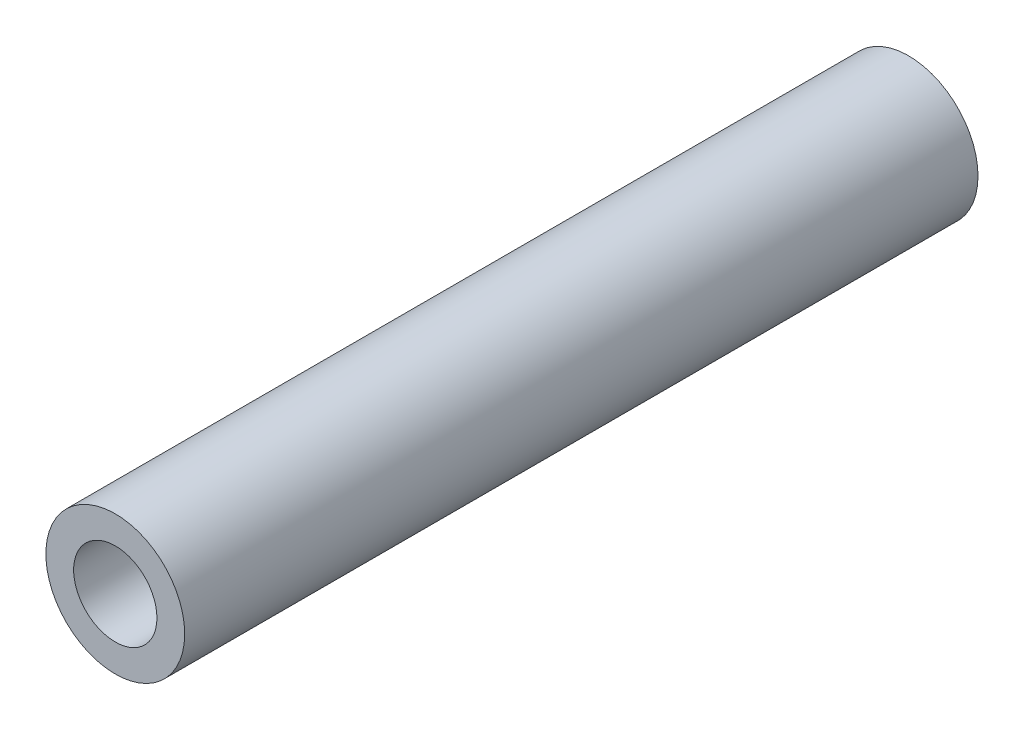
ISO-10303-21;
HEADER;
FILE_DESCRIPTION(('STEP AP214'),'2;1');
FILE_NAME('part.step','',(''),(''),'','','');
FILE_SCHEMA(('AUTOMOTIVE_DESIGN { 1 0 10303 214 1 1 1 1 }'));
ENDSEC;
DATA;
#1=APPLICATION_CONTEXT('core data for automotive mechanical design processes');
#2=APPLICATION_PROTOCOL_DEFINITION('international standard','automotive_design',2000,#1);
#3=PRODUCT_CONTEXT('',#1,'mechanical');
#4=PRODUCT('Part','Part','',(#3));
#5=PRODUCT_RELATED_PRODUCT_CATEGORY('part','',(#4));
#6=PRODUCT_DEFINITION_FORMATION('','',#4);
#7=PRODUCT_DEFINITION_CONTEXT('part definition',#1,'design');
#8=PRODUCT_DEFINITION('design','',#6,#7);
#9=PRODUCT_DEFINITION_SHAPE('','',#8);
#10=(LENGTH_UNIT() NAMED_UNIT(*) SI_UNIT(.MILLI.,.METRE.));
#11=(NAMED_UNIT(*) PLANE_ANGLE_UNIT() SI_UNIT($,.RADIAN.));
#12=(NAMED_UNIT(*) SI_UNIT($,.STERADIAN.) SOLID_ANGLE_UNIT());
#13=UNCERTAINTY_MEASURE_WITH_UNIT(LENGTH_MEASURE(1.E-05),#10,'distance_accuracy_value','');
#14=(GEOMETRIC_REPRESENTATION_CONTEXT(3) GLOBAL_UNCERTAINTY_ASSIGNED_CONTEXT((#13)) GLOBAL_UNIT_ASSIGNED_CONTEXT((#10,
#11,#12)) REPRESENTATION_CONTEXT('',''));
#15=CARTESIAN_POINT('',(0.,0.,0.));
#16=DIRECTION('',(0.,0.,1.));
#17=DIRECTION('',(1.,0.,0.));
#18=AXIS2_PLACEMENT_3D('',#15,#16,#17);
#19=CARTESIAN_POINT('',(-93.8485626491029,33.5124234951683,40.));
#20=DIRECTION('',(0.,0.,1.));
#21=DIRECTION('',(1.,0.,0.));
#22=AXIS2_PLACEMENT_3D('',#19,#20,#21);
#23=PLANE('',#22);
#24=CARTESIAN_POINT('',(-93.8485626491029,33.5124234951683,40.));
#25=DIRECTION('',(0.,0.,1.));
#26=DIRECTION('',(1.,0.,0.));
#27=AXIS2_PLACEMENT_3D('',#24,#25,#26);
#28=CIRCLE('',#27,3.50000000000001);
#29=CARTESIAN_POINT('',(-90.3485626491029,33.5124234951683,40.));
#30=VERTEX_POINT('',#29);
#31=EDGE_CURVE('E10',#30,#30,#28,.T.);
#32=ORIENTED_EDGE('',*,*,#31,.T.);
#33=EDGE_LOOP('',(#32));
#34=FACE_BOUND('',#33,.T.);
#35=CARTESIAN_POINT('',(-93.8485626491029,33.5124234951683,40.));
#36=DIRECTION('',(0.,0.,1.));
#37=DIRECTION('',(1.,0.,0.));
#38=AXIS2_PLACEMENT_3D('',#35,#36,#37);
#39=CIRCLE('',#38,2.1);
#40=CARTESIAN_POINT('',(-91.7485626491029,33.5124234951683,40.));
#41=VERTEX_POINT('',#40);
#42=EDGE_CURVE('E48',#41,#41,#39,.T.);
#43=ORIENTED_EDGE('',*,*,#42,.F.);
#44=EDGE_LOOP('',(#43));
#45=FACE_BOUND('',#44,.T.);
#46=ADVANCED_FACE('F37',(#34,#45),#23,.T.);
#47=CARTESIAN_POINT('',(-93.8485626491029,33.5124234951683,0.));
#48=DIRECTION('',(0.,0.,1.));
#49=DIRECTION('',(1.,0.,0.));
#50=AXIS2_PLACEMENT_3D('',#47,#48,#49);
#51=PLANE('',#50);
#52=CARTESIAN_POINT('',(-93.8485626491029,33.5124234951683,0.));
#53=DIRECTION('',(0.,0.,1.));
#54=DIRECTION('',(1.,0.,0.));
#55=AXIS2_PLACEMENT_3D('',#52,#53,#54);
#56=CIRCLE('',#55,3.50000000000001);
#57=CARTESIAN_POINT('',(-90.3485626491029,33.5124234951683,0.));
#58=VERTEX_POINT('',#57);
#59=EDGE_CURVE('E41',#58,#58,#56,.T.);
#60=ORIENTED_EDGE('',*,*,#59,.F.);
#61=EDGE_LOOP('',(#60));
#62=FACE_BOUND('',#61,.T.);
#63=CARTESIAN_POINT('',(-93.8485626491029,33.5124234951683,0.));
#64=DIRECTION('',(0.,0.,1.));
#65=DIRECTION('',(1.,0.,0.));
#66=AXIS2_PLACEMENT_3D('',#63,#64,#65);
#67=CIRCLE('',#66,2.1);
#68=CARTESIAN_POINT('',(-91.7485626491029,33.5124234951683,0.));
#69=VERTEX_POINT('',#68);
#70=EDGE_CURVE('E50',#69,#69,#67,.T.);
#71=ORIENTED_EDGE('',*,*,#70,.T.);
#72=EDGE_LOOP('',(#71));
#73=FACE_BOUND('',#72,.T.);
#74=ADVANCED_FACE('F60',(#62,#73),#51,.F.);
#75=CARTESIAN_POINT('',(-93.8485626491029,33.5124234951683,40.));
#76=DIRECTION('',(0.,0.,-1.));
#77=DIRECTION('',(-1.,0.,0.));
#78=AXIS2_PLACEMENT_3D('',#75,#76,#77);
#79=CYLINDRICAL_SURFACE('',#78,3.50000000000001);
#80=ORIENTED_EDGE('',*,*,#31,.F.);
#81=EDGE_LOOP('',(#80));
#82=FACE_BOUND('',#81,.T.);
#83=ORIENTED_EDGE('',*,*,#59,.T.);
#84=EDGE_LOOP('',(#83));
#85=FACE_BOUND('',#84,.T.);
#86=ADVANCED_FACE('F39',(#82,#85),#79,.T.);
#87=CARTESIAN_POINT('',(-93.8485626491029,33.5124234951683,40.));
#88=DIRECTION('',(0.,0.,-1.));
#89=DIRECTION('',(-1.,0.,0.));
#90=AXIS2_PLACEMENT_3D('',#87,#88,#89);
#91=CYLINDRICAL_SURFACE('',#90,2.1);
#92=ORIENTED_EDGE('',*,*,#42,.T.);
#93=EDGE_LOOP('',(#92));
#94=FACE_BOUND('',#93,.T.);
#95=ORIENTED_EDGE('',*,*,#70,.F.);
#96=EDGE_LOOP('',(#95));
#97=FACE_BOUND('',#96,.T.);
#98=ADVANCED_FACE('F56',(#94,#97),#91,.F.);
#99=CLOSED_SHELL('',(#46,#74,#86,#98));
#100=MANIFOLD_SOLID_BREP('B2',#99);
#101=ADVANCED_BREP_SHAPE_REPRESENTATION('',(#18,#100),#14);
#102=SHAPE_DEFINITION_REPRESENTATION(#9,#101);
ENDSEC;
END-ISO-10303-21;
